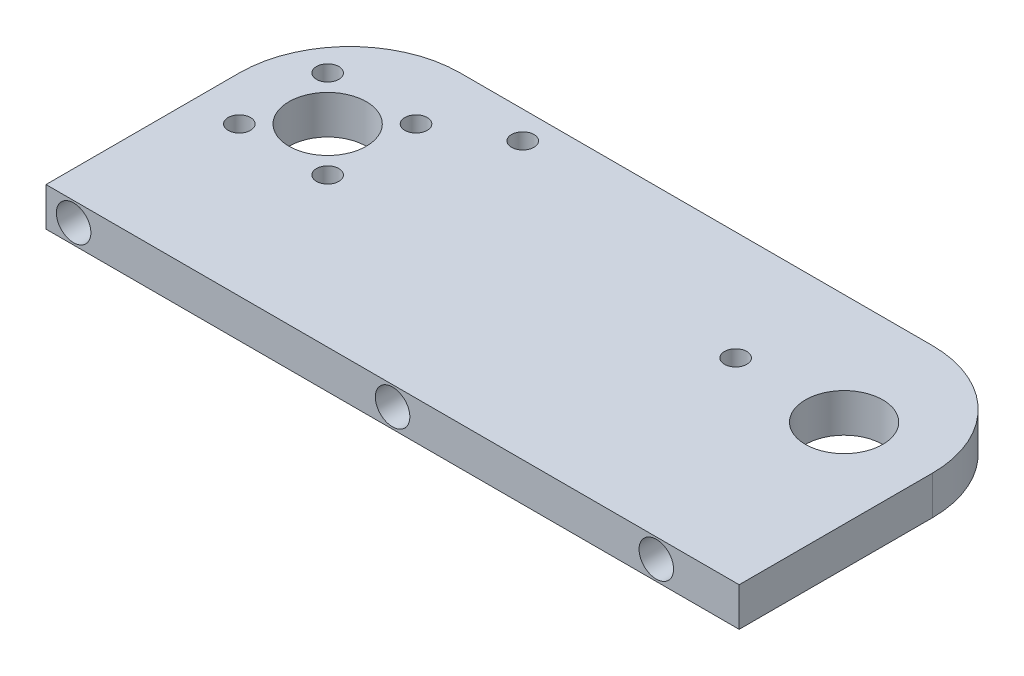
ISO-10303-21;
HEADER;
FILE_DESCRIPTION(('STEP AP214'),'2;1');
FILE_NAME('part.step','',(''),(''),'','','');
FILE_SCHEMA(('AUTOMOTIVE_DESIGN { 1 0 10303 214 1 1 1 1 }'));
ENDSEC;
DATA;
#1=APPLICATION_CONTEXT('core data for automotive mechanical design processes');
#2=APPLICATION_PROTOCOL_DEFINITION('international standard','automotive_design',2000,#1);
#3=PRODUCT_CONTEXT('',#1,'mechanical');
#4=PRODUCT('Part','Part','',(#3));
#5=PRODUCT_RELATED_PRODUCT_CATEGORY('part','',(#4));
#6=PRODUCT_DEFINITION_FORMATION('','',#4);
#7=PRODUCT_DEFINITION_CONTEXT('part definition',#1,'design');
#8=PRODUCT_DEFINITION('design','',#6,#7);
#9=PRODUCT_DEFINITION_SHAPE('','',#8);
#10=(LENGTH_UNIT() NAMED_UNIT(*) SI_UNIT(.MILLI.,.METRE.));
#11=(NAMED_UNIT(*) PLANE_ANGLE_UNIT() SI_UNIT($,.RADIAN.));
#12=(NAMED_UNIT(*) SI_UNIT($,.STERADIAN.) SOLID_ANGLE_UNIT());
#13=UNCERTAINTY_MEASURE_WITH_UNIT(LENGTH_MEASURE(1.E-05),#10,'distance_accuracy_value','');
#14=(GEOMETRIC_REPRESENTATION_CONTEXT(3) GLOBAL_UNCERTAINTY_ASSIGNED_CONTEXT((#13)) GLOBAL_UNIT_ASSIGNED_CONTEXT((#10,
#11,#12)) REPRESENTATION_CONTEXT('',''));
#15=CARTESIAN_POINT('',(0.,0.,0.));
#16=DIRECTION('',(0.,0.,1.));
#17=DIRECTION('',(1.,0.,0.));
#18=AXIS2_PLACEMENT_3D('',#15,#16,#17);
#19=CARTESIAN_POINT('',(145.701194149682,7.,0.));
#20=DIRECTION('',(1.,0.,0.));
#21=DIRECTION('',(0.,0.,-1.));
#22=AXIS2_PLACEMENT_3D('',#19,#20,#21);
#23=PLANE('',#22);
#24=DIRECTION('',(0.,0.,1.));
#25=VECTOR('',#24,1.);
#26=CARTESIAN_POINT('',(145.701194149682,0.,0.));
#27=LINE('',#26,#25);
#28=CARTESIAN_POINT('',(145.701194149682,0.,-31.8964427000415));
#29=VERTEX_POINT('',#28);
#30=CARTESIAN_POINT('',(145.701194149682,0.,3.10355729995856));
#31=VERTEX_POINT('',#30);
#32=EDGE_CURVE('E177',#29,#31,#27,.T.);
#33=ORIENTED_EDGE('',*,*,#32,.F.);
#34=DIRECTION('',(0.,-1.,0.));
#35=VECTOR('',#34,1.);
#36=CARTESIAN_POINT('',(145.701194149682,7.,-31.8964427000415));
#37=LINE('',#36,#35);
#38=CARTESIAN_POINT('',(145.701194149682,7.,-31.8964427000415));
#39=VERTEX_POINT('',#38);
#40=EDGE_CURVE('E68',#29,#39,#37,.F.);
#41=ORIENTED_EDGE('',*,*,#40,.T.);
#42=DIRECTION('',(0.,0.,1.));
#43=VECTOR('',#42,1.);
#44=CARTESIAN_POINT('',(145.701194149682,7.,0.));
#45=LINE('',#44,#43);
#46=CARTESIAN_POINT('',(145.701194149682,7.,3.10355729995856));
#47=VERTEX_POINT('',#46);
#48=EDGE_CURVE('E168',#39,#47,#45,.T.);
#49=ORIENTED_EDGE('',*,*,#48,.T.);
#50=DIRECTION('',(0.,-1.,0.));
#51=VECTOR('',#50,1.);
#52=CARTESIAN_POINT('',(145.701194149682,7.,3.10355729995856));
#53=LINE('',#52,#51);
#54=EDGE_CURVE('E114',#47,#31,#53,.T.);
#55=ORIENTED_EDGE('',*,*,#54,.T.);
#56=EDGE_LOOP('',(#33,#41,#49,#55));
#57=FACE_BOUND('',#56,.T.);
#58=ADVANCED_FACE('F43',(#57),#23,.T.);
#59=CARTESIAN_POINT('',(0.,7.,-51.8964427000415));
#60=DIRECTION('',(0.,0.,-1.));
#61=DIRECTION('',(-1.,0.,0.));
#62=AXIS2_PLACEMENT_3D('',#59,#60,#61);
#63=PLANE('',#62);
#64=DIRECTION('',(1.,0.,0.));
#65=VECTOR('',#64,1.);
#66=CARTESIAN_POINT('',(0.,7.,-51.8964427000415));
#67=LINE('',#66,#65);
#68=CARTESIAN_POINT('',(40.1890615993969,7.,-51.8964427000415));
#69=VERTEX_POINT('',#68);
#70=CARTESIAN_POINT('',(125.701194149682,7.,-51.8964427000415));
#71=VERTEX_POINT('',#70);
#72=EDGE_CURVE('E106',#69,#71,#67,.T.);
#73=ORIENTED_EDGE('',*,*,#72,.T.);
#74=DIRECTION('',(0.,-1.,0.));
#75=VECTOR('',#74,1.);
#76=CARTESIAN_POINT('',(125.701194149682,7.,-51.8964427000415));
#77=LINE('',#76,#75);
#78=CARTESIAN_POINT('',(125.701194149682,0.,-51.8964427000415));
#79=VERTEX_POINT('',#78);
#80=EDGE_CURVE('E122',#71,#79,#77,.T.);
#81=ORIENTED_EDGE('',*,*,#80,.T.);
#82=DIRECTION('',(1.,0.,0.));
#83=VECTOR('',#82,1.);
#84=CARTESIAN_POINT('',(0.,0.,-51.8964427000415));
#85=LINE('',#84,#83);
#86=CARTESIAN_POINT('',(40.1890615993969,0.,-51.8964427000415));
#87=VERTEX_POINT('',#86);
#88=EDGE_CURVE('E179',#87,#79,#85,.T.);
#89=ORIENTED_EDGE('',*,*,#88,.F.);
#90=DIRECTION('',(0.,-1.,0.));
#91=VECTOR('',#90,1.);
#92=CARTESIAN_POINT('',(40.1890615993969,7.,-51.8964427000415));
#93=LINE('',#92,#91);
#94=EDGE_CURVE('E120',#87,#69,#93,.F.);
#95=ORIENTED_EDGE('',*,*,#94,.T.);
#96=EDGE_LOOP('',(#73,#81,#89,#95));
#97=FACE_BOUND('',#96,.T.);
#98=ADVANCED_FACE('F190',(#97),#63,.T.);
#99=CARTESIAN_POINT('',(20.1890615993969,7.,0.));
#100=DIRECTION('',(1.,0.,0.));
#101=DIRECTION('',(0.,0.,-1.));
#102=AXIS2_PLACEMENT_3D('',#99,#100,#101);
#103=PLANE('',#102);
#104=DIRECTION('',(0.,0.,1.));
#105=VECTOR('',#104,1.);
#106=CARTESIAN_POINT('',(20.1890615993969,7.,0.));
#107=LINE('',#106,#105);
#108=CARTESIAN_POINT('',(20.1890615993969,7.,-31.8964427000415));
#109=VERTEX_POINT('',#108);
#110=CARTESIAN_POINT('',(20.1890615993969,7.,3.10355729995856));
#111=VERTEX_POINT('',#110);
#112=EDGE_CURVE('E98',#109,#111,#107,.T.);
#113=ORIENTED_EDGE('',*,*,#112,.F.);
#114=DIRECTION('',(0.,-1.,0.));
#115=VECTOR('',#114,1.);
#116=CARTESIAN_POINT('',(20.1890615993969,0.,-31.8964427000415));
#117=LINE('',#116,#115);
#118=CARTESIAN_POINT('',(20.1890615993969,0.,-31.8964427000415));
#119=VERTEX_POINT('',#118);
#120=EDGE_CURVE('E11',#109,#119,#117,.T.);
#121=ORIENTED_EDGE('',*,*,#120,.T.);
#122=DIRECTION('',(0.,0.,1.));
#123=VECTOR('',#122,1.);
#124=CARTESIAN_POINT('',(20.1890615993969,0.,0.));
#125=LINE('',#124,#123);
#126=CARTESIAN_POINT('',(20.1890615993969,0.,3.10355729995856));
#127=VERTEX_POINT('',#126);
#128=EDGE_CURVE('E118',#119,#127,#125,.T.);
#129=ORIENTED_EDGE('',*,*,#128,.T.);
#130=DIRECTION('',(0.,-1.,0.));
#131=VECTOR('',#130,1.);
#132=CARTESIAN_POINT('',(20.1890615993969,7.,3.10355729995856));
#133=LINE('',#132,#131);
#134=EDGE_CURVE('E112',#111,#127,#133,.T.);
#135=ORIENTED_EDGE('',*,*,#134,.F.);
#136=EDGE_LOOP('',(#113,#121,#129,#135));
#137=FACE_BOUND('',#136,.T.);
#138=ADVANCED_FACE('F116',(#137),#103,.F.);
#139=CARTESIAN_POINT('',(36.1890615993969,7.,-31.8964427000415));
#140=DIRECTION('',(0.,-1.,0.));
#141=DIRECTION('',(0.,0.,-1.));
#142=AXIS2_PLACEMENT_3D('',#139,#140,#141);
#143=CYLINDRICAL_SURFACE('',#142,7.);
#144=CARTESIAN_POINT('',(36.1890615993969,7.,-31.8964427000415));
#145=DIRECTION('',(0.,1.,0.));
#146=DIRECTION('',(0.,0.,1.));
#147=AXIS2_PLACEMENT_3D('',#144,#145,#146);
#148=CIRCLE('',#147,7.);
#149=CARTESIAN_POINT('',(36.1890615993969,7.,-24.8964427000415));
#150=VERTEX_POINT('',#149);
#151=EDGE_CURVE('E164',#150,#150,#148,.T.);
#152=ORIENTED_EDGE('',*,*,#151,.T.);
#153=EDGE_LOOP('',(#152));
#154=FACE_BOUND('',#153,.T.);
#155=CARTESIAN_POINT('',(36.1890615993969,0.,-31.8964427000415));
#156=DIRECTION('',(0.,1.,0.));
#157=DIRECTION('',(0.,0.,1.));
#158=AXIS2_PLACEMENT_3D('',#155,#156,#157);
#159=CIRCLE('',#158,7.);
#160=CARTESIAN_POINT('',(36.1890615993969,0.,-24.8964427000415));
#161=VERTEX_POINT('',#160);
#162=EDGE_CURVE('E174',#161,#161,#159,.T.);
#163=ORIENTED_EDGE('',*,*,#162,.F.);
#164=EDGE_LOOP('',(#163));
#165=FACE_BOUND('',#164,.T.);
#166=ADVANCED_FACE('F209',(#154,#165),#143,.F.);
#167=CARTESIAN_POINT('',(129.701194149682,7.,-31.8964427000415));
#168=DIRECTION('',(0.,-1.,0.));
#169=DIRECTION('',(0.,0.,-1.));
#170=AXIS2_PLACEMENT_3D('',#167,#168,#169);
#171=CYLINDRICAL_SURFACE('',#170,7.00000000000001);
#172=CARTESIAN_POINT('',(129.701194149682,7.,-31.8964427000415));
#173=DIRECTION('',(0.,1.,0.));
#174=DIRECTION('',(0.,0.,1.));
#175=AXIS2_PLACEMENT_3D('',#172,#173,#174);
#176=CIRCLE('',#175,7.00000000000001);
#177=CARTESIAN_POINT('',(129.701194149682,7.,-24.8964427000414));
#178=VERTEX_POINT('',#177);
#179=EDGE_CURVE('E161',#178,#178,#176,.T.);
#180=ORIENTED_EDGE('',*,*,#179,.T.);
#181=EDGE_LOOP('',(#180));
#182=FACE_BOUND('',#181,.T.);
#183=CARTESIAN_POINT('',(129.701194149682,0.,-31.8964427000415));
#184=DIRECTION('',(0.,1.,0.));
#185=DIRECTION('',(0.,0.,1.));
#186=AXIS2_PLACEMENT_3D('',#183,#184,#185);
#187=CIRCLE('',#186,7.00000000000001);
#188=CARTESIAN_POINT('',(129.701194149682,0.,-24.8964427000414));
#189=VERTEX_POINT('',#188);
#190=EDGE_CURVE('E139',#189,#189,#187,.T.);
#191=ORIENTED_EDGE('',*,*,#190,.F.);
#192=EDGE_LOOP('',(#191));
#193=FACE_BOUND('',#192,.T.);
#194=ADVANCED_FACE('F212',(#182,#193),#171,.F.);
#195=CARTESIAN_POINT('',(0.,7.,3.10355729995856));
#196=DIRECTION('',(0.,0.,-1.));
#197=DIRECTION('',(-1.,0.,0.));
#198=AXIS2_PLACEMENT_3D('',#195,#196,#197);
#199=PLANE('',#198);
#200=CARTESIAN_POINT('',(25.1890615993969,3.5,3.10355729995856));
#201=DIRECTION('',(0.,0.,1.));
#202=DIRECTION('',(1.,0.,0.));
#203=AXIS2_PLACEMENT_3D('',#200,#201,#202);
#204=CIRCLE('',#203,3.125);
#205=CARTESIAN_POINT('',(28.3140615993969,3.5,3.10355729995856));
#206=VERTEX_POINT('',#205);
#207=EDGE_CURVE('E437',#206,#206,#204,.T.);
#208=ORIENTED_EDGE('',*,*,#207,.F.);
#209=EDGE_LOOP('',(#208));
#210=FACE_BOUND('',#209,.T.);
#211=CARTESIAN_POINT('',(130.701194149682,3.5,3.10355729995856));
#212=DIRECTION('',(0.,0.,1.));
#213=DIRECTION('',(1.,0.,0.));
#214=AXIS2_PLACEMENT_3D('',#211,#212,#213);
#215=CIRCLE('',#214,3.125);
#216=CARTESIAN_POINT('',(133.826194149682,3.5,3.10355729995856));
#217=VERTEX_POINT('',#216);
#218=EDGE_CURVE('E443',#217,#217,#215,.T.);
#219=ORIENTED_EDGE('',*,*,#218,.F.);
#220=EDGE_LOOP('',(#219));
#221=FACE_BOUND('',#220,.T.);
#222=CARTESIAN_POINT('',(82.9451278745395,3.5,3.10355729995856));
#223=DIRECTION('',(0.,0.,1.));
#224=DIRECTION('',(1.,0.,0.));
#225=AXIS2_PLACEMENT_3D('',#222,#223,#224);
#226=CIRCLE('',#225,3.125);
#227=CARTESIAN_POINT('',(86.0701278745395,3.5,3.10355729995856));
#228=VERTEX_POINT('',#227);
#229=EDGE_CURVE('E430',#228,#228,#226,.T.);
#230=ORIENTED_EDGE('',*,*,#229,.F.);
#231=EDGE_LOOP('',(#230));
#232=FACE_BOUND('',#231,.T.);
#233=DIRECTION('',(1.,0.,0.));
#234=VECTOR('',#233,1.);
#235=CARTESIAN_POINT('',(0.,0.,3.10355729995856));
#236=LINE('',#235,#234);
#237=EDGE_CURVE('E165',#127,#31,#236,.T.);
#238=ORIENTED_EDGE('',*,*,#237,.T.);
#239=ORIENTED_EDGE('',*,*,#54,.F.);
#240=DIRECTION('',(1.,0.,0.));
#241=VECTOR('',#240,1.);
#242=CARTESIAN_POINT('',(0.,7.,3.10355729995856));
#243=LINE('',#242,#241);
#244=EDGE_CURVE('E101',#111,#47,#243,.T.);
#245=ORIENTED_EDGE('',*,*,#244,.F.);
#246=ORIENTED_EDGE('',*,*,#134,.T.);
#247=EDGE_LOOP('',(#238,#239,#245,#246));
#248=FACE_BOUND('',#247,.T.);
#249=ADVANCED_FACE('F111',(#210,#221,#232,#248),#199,.F.);
#250=CARTESIAN_POINT('',(0.,7.,0.));
#251=DIRECTION('',(0.,1.,0.));
#252=DIRECTION('',(0.,0.,1.));
#253=AXIS2_PLACEMENT_3D('',#250,#251,#252);
#254=PLANE('',#253);
#255=CARTESIAN_POINT('',(56.5146564494441,7.,-46.8964427000415));
#256=DIRECTION('',(0.,1.,0.));
#257=DIRECTION('',(0.,0.,1.));
#258=AXIS2_PLACEMENT_3D('',#255,#256,#257);
#259=CIRCLE('',#258,2.025);
#260=CARTESIAN_POINT('',(56.5146564494441,7.,-44.8714427000415));
#261=VERTEX_POINT('',#260);
#262=EDGE_CURVE('E428',#261,#261,#259,.T.);
#263=ORIENTED_EDGE('',*,*,#262,.F.);
#264=EDGE_LOOP('',(#263));
#265=FACE_BOUND('',#264,.T.);
#266=CARTESIAN_POINT('',(44.1890615993971,7.,-23.8964427000416));
#267=DIRECTION('',(0.,1.,0.));
#268=DIRECTION('',(0.,0.,1.));
#269=AXIS2_PLACEMENT_3D('',#266,#267,#268);
#270=CIRCLE('',#269,2.025);
#271=CARTESIAN_POINT('',(44.1890615993971,7.,-21.8714427000416));
#272=VERTEX_POINT('',#271);
#273=EDGE_CURVE('E436',#272,#272,#270,.T.);
#274=ORIENTED_EDGE('',*,*,#273,.F.);
#275=EDGE_LOOP('',(#274));
#276=FACE_BOUND('',#275,.T.);
#277=CARTESIAN_POINT('',(28.189061599397,7.,-23.8964427000415));
#278=DIRECTION('',(0.,1.,0.));
#279=DIRECTION('',(0.,0.,1.));
#280=AXIS2_PLACEMENT_3D('',#277,#278,#279);
#281=CIRCLE('',#280,2.025);
#282=CARTESIAN_POINT('',(28.189061599397,7.,-21.8714427000415));
#283=VERTEX_POINT('',#282);
#284=EDGE_CURVE('E454',#283,#283,#281,.T.);
#285=ORIENTED_EDGE('',*,*,#284,.F.);
#286=EDGE_LOOP('',(#285));
#287=FACE_BOUND('',#286,.T.);
#288=CARTESIAN_POINT('',(28.1890615993969,7.,-39.8964427000415));
#289=DIRECTION('',(0.,1.,0.));
#290=DIRECTION('',(0.,0.,1.));
#291=AXIS2_PLACEMENT_3D('',#288,#289,#290);
#292=CIRCLE('',#291,2.025);
#293=CARTESIAN_POINT('',(28.1890615993969,7.,-37.8714427000415));
#294=VERTEX_POINT('',#293);
#295=EDGE_CURVE('E451',#294,#294,#292,.T.);
#296=ORIENTED_EDGE('',*,*,#295,.F.);
#297=EDGE_LOOP('',(#296));
#298=FACE_BOUND('',#297,.T.);
#299=CARTESIAN_POINT('',(44.1890615993969,7.,-39.8964427000417));
#300=DIRECTION('',(0.,1.,0.));
#301=DIRECTION('',(0.,0.,1.));
#302=AXIS2_PLACEMENT_3D('',#299,#300,#301);
#303=CIRCLE('',#302,2.025);
#304=CARTESIAN_POINT('',(44.1890615993969,7.,-37.8714427000417));
#305=VERTEX_POINT('',#304);
#306=EDGE_CURVE('E145',#305,#305,#303,.T.);
#307=ORIENTED_EDGE('',*,*,#306,.F.);
#308=EDGE_LOOP('',(#307));
#309=FACE_BOUND('',#308,.T.);
#310=CARTESIAN_POINT('',(109.811194149682,7.,-32.1464427000415));
#311=DIRECTION('',(0.,1.,0.));
#312=DIRECTION('',(0.,0.,1.));
#313=AXIS2_PLACEMENT_3D('',#310,#311,#312);
#314=CIRCLE('',#313,2.02499999999999);
#315=CARTESIAN_POINT('',(109.811194149682,7.,-30.1214427000415));
#316=VERTEX_POINT('',#315);
#317=EDGE_CURVE('E140',#316,#316,#314,.T.);
#318=ORIENTED_EDGE('',*,*,#317,.F.);
#319=EDGE_LOOP('',(#318));
#320=FACE_BOUND('',#319,.T.);
#321=ORIENTED_EDGE('',*,*,#179,.F.);
#322=EDGE_LOOP('',(#321));
#323=FACE_BOUND('',#322,.T.);
#324=ORIENTED_EDGE('',*,*,#151,.F.);
#325=EDGE_LOOP('',(#324));
#326=FACE_BOUND('',#325,.T.);
#327=ORIENTED_EDGE('',*,*,#48,.F.);
#328=CARTESIAN_POINT('',(125.701194149682,7.,-31.8964427000415));
#329=DIRECTION('',(0.,1.,0.));
#330=DIRECTION('',(0.,0.,1.));
#331=AXIS2_PLACEMENT_3D('',#328,#329,#330);
#332=CIRCLE('',#331,20.);
#333=EDGE_CURVE('E52',#39,#71,#332,.T.);
#334=ORIENTED_EDGE('',*,*,#333,.T.);
#335=ORIENTED_EDGE('',*,*,#72,.F.);
#336=CARTESIAN_POINT('',(40.1890615993969,7.,-31.8964427000415));
#337=DIRECTION('',(0.,1.,0.));
#338=DIRECTION('',(0.,0.,1.));
#339=AXIS2_PLACEMENT_3D('',#336,#337,#338);
#340=CIRCLE('',#339,20.);
#341=EDGE_CURVE('E60',#69,#109,#340,.T.);
#342=ORIENTED_EDGE('',*,*,#341,.T.);
#343=ORIENTED_EDGE('',*,*,#112,.T.);
#344=ORIENTED_EDGE('',*,*,#244,.T.);
#345=EDGE_LOOP('',(#327,#334,#335,#342,#343,#344));
#346=FACE_BOUND('',#345,.T.);
#347=ADVANCED_FACE('F100',(#265,#276,#287,#298,#309,#320,#323,#326,#346),#254,.T.);
#348=CARTESIAN_POINT('',(0.,0.,0.));
#349=DIRECTION('',(0.,1.,0.));
#350=DIRECTION('',(0.,0.,1.));
#351=AXIS2_PLACEMENT_3D('',#348,#349,#350);
#352=PLANE('',#351);
#353=CARTESIAN_POINT('',(56.5146564494441,0.,-46.8964427000415));
#354=DIRECTION('',(0.,1.,0.));
#355=DIRECTION('',(0.,0.,1.));
#356=AXIS2_PLACEMENT_3D('',#353,#354,#355);
#357=CIRCLE('',#356,2.025);
#358=CARTESIAN_POINT('',(56.5146564494441,0.,-44.8714427000415));
#359=VERTEX_POINT('',#358);
#360=EDGE_CURVE('E425',#359,#359,#357,.T.);
#361=ORIENTED_EDGE('',*,*,#360,.T.);
#362=EDGE_LOOP('',(#361));
#363=FACE_BOUND('',#362,.T.);
#364=CARTESIAN_POINT('',(44.1890615993971,0.,-23.8964427000416));
#365=DIRECTION('',(0.,1.,0.));
#366=DIRECTION('',(0.,0.,1.));
#367=AXIS2_PLACEMENT_3D('',#364,#365,#366);
#368=CIRCLE('',#367,2.025);
#369=CARTESIAN_POINT('',(44.1890615993971,0.,-21.8714427000416));
#370=VERTEX_POINT('',#369);
#371=EDGE_CURVE('E47',#370,#370,#368,.T.);
#372=ORIENTED_EDGE('',*,*,#371,.T.);
#373=EDGE_LOOP('',(#372));
#374=FACE_BOUND('',#373,.T.);
#375=CARTESIAN_POINT('',(28.189061599397,0.,-23.8964427000415));
#376=DIRECTION('',(0.,1.,0.));
#377=DIRECTION('',(0.,0.,1.));
#378=AXIS2_PLACEMENT_3D('',#375,#376,#377);
#379=CIRCLE('',#378,2.025);
#380=CARTESIAN_POINT('',(28.189061599397,0.,-21.8714427000415));
#381=VERTEX_POINT('',#380);
#382=EDGE_CURVE('E147',#381,#381,#379,.T.);
#383=ORIENTED_EDGE('',*,*,#382,.T.);
#384=EDGE_LOOP('',(#383));
#385=FACE_BOUND('',#384,.T.);
#386=CARTESIAN_POINT('',(28.1890615993969,0.,-39.8964427000415));
#387=DIRECTION('',(0.,1.,0.));
#388=DIRECTION('',(0.,0.,1.));
#389=AXIS2_PLACEMENT_3D('',#386,#387,#388);
#390=CIRCLE('',#389,2.025);
#391=CARTESIAN_POINT('',(28.1890615993969,0.,-37.8714427000415));
#392=VERTEX_POINT('',#391);
#393=EDGE_CURVE('E144',#392,#392,#390,.T.);
#394=ORIENTED_EDGE('',*,*,#393,.T.);
#395=EDGE_LOOP('',(#394));
#396=FACE_BOUND('',#395,.T.);
#397=CARTESIAN_POINT('',(44.1890615993969,0.,-39.8964427000417));
#398=DIRECTION('',(0.,1.,0.));
#399=DIRECTION('',(0.,0.,1.));
#400=AXIS2_PLACEMENT_3D('',#397,#398,#399);
#401=CIRCLE('',#400,2.025);
#402=CARTESIAN_POINT('',(44.1890615993969,0.,-37.8714427000417));
#403=VERTEX_POINT('',#402);
#404=EDGE_CURVE('E141',#403,#403,#401,.T.);
#405=ORIENTED_EDGE('',*,*,#404,.T.);
#406=EDGE_LOOP('',(#405));
#407=FACE_BOUND('',#406,.T.);
#408=CARTESIAN_POINT('',(109.811194149682,0.,-32.1464427000415));
#409=DIRECTION('',(0.,1.,0.));
#410=DIRECTION('',(0.,0.,1.));
#411=AXIS2_PLACEMENT_3D('',#408,#409,#410);
#412=CIRCLE('',#411,2.02499999999999);
#413=CARTESIAN_POINT('',(109.811194149682,0.,-30.1214427000415));
#414=VERTEX_POINT('',#413);
#415=EDGE_CURVE('E136',#414,#414,#412,.T.);
#416=ORIENTED_EDGE('',*,*,#415,.T.);
#417=EDGE_LOOP('',(#416));
#418=FACE_BOUND('',#417,.T.);
#419=ORIENTED_EDGE('',*,*,#190,.T.);
#420=EDGE_LOOP('',(#419));
#421=FACE_BOUND('',#420,.T.);
#422=ORIENTED_EDGE('',*,*,#162,.T.);
#423=EDGE_LOOP('',(#422));
#424=FACE_BOUND('',#423,.T.);
#425=ORIENTED_EDGE('',*,*,#88,.T.);
#426=CARTESIAN_POINT('',(125.701194149682,0.,-31.8964427000415));
#427=DIRECTION('',(0.,1.,0.));
#428=DIRECTION('',(0.,0.,1.));
#429=AXIS2_PLACEMENT_3D('',#426,#427,#428);
#430=CIRCLE('',#429,20.);
#431=EDGE_CURVE('E131',#79,#29,#430,.F.);
#432=ORIENTED_EDGE('',*,*,#431,.T.);
#433=ORIENTED_EDGE('',*,*,#32,.T.);
#434=ORIENTED_EDGE('',*,*,#237,.F.);
#435=ORIENTED_EDGE('',*,*,#128,.F.);
#436=CARTESIAN_POINT('',(40.1890615993969,0.,-31.8964427000415));
#437=DIRECTION('',(0.,1.,0.));
#438=DIRECTION('',(0.,0.,1.));
#439=AXIS2_PLACEMENT_3D('',#436,#437,#438);
#440=CIRCLE('',#439,20.);
#441=EDGE_CURVE('E129',#119,#87,#440,.F.);
#442=ORIENTED_EDGE('',*,*,#441,.T.);
#443=EDGE_LOOP('',(#425,#432,#433,#434,#435,#442));
#444=FACE_BOUND('',#443,.T.);
#445=ADVANCED_FACE('F183',(#363,#374,#385,#396,#407,#418,#421,#424,#444),#352,.F.);
#446=CARTESIAN_POINT('',(125.701194149682,7.,-31.8964427000415));
#447=DIRECTION('',(0.,-1.,0.));
#448=DIRECTION('',(0.,0.,-1.));
#449=AXIS2_PLACEMENT_3D('',#446,#447,#448);
#450=CYLINDRICAL_SURFACE('',#449,20.);
#451=ORIENTED_EDGE('',*,*,#333,.F.);
#452=ORIENTED_EDGE('',*,*,#40,.F.);
#453=ORIENTED_EDGE('',*,*,#431,.F.);
#454=ORIENTED_EDGE('',*,*,#80,.F.);
#455=EDGE_LOOP('',(#451,#452,#453,#454));
#456=FACE_BOUND('',#455,.T.);
#457=ADVANCED_FACE('F187',(#456),#450,.T.);
#458=CARTESIAN_POINT('',(40.1890615993969,7.,-31.8964427000415));
#459=DIRECTION('',(0.,1.,0.));
#460=DIRECTION('',(0.,0.,1.));
#461=AXIS2_PLACEMENT_3D('',#458,#459,#460);
#462=CYLINDRICAL_SURFACE('',#461,20.);
#463=ORIENTED_EDGE('',*,*,#341,.F.);
#464=ORIENTED_EDGE('',*,*,#94,.F.);
#465=ORIENTED_EDGE('',*,*,#441,.F.);
#466=ORIENTED_EDGE('',*,*,#120,.F.);
#467=EDGE_LOOP('',(#463,#464,#465,#466));
#468=FACE_BOUND('',#467,.T.);
#469=ADVANCED_FACE('F45',(#468),#462,.T.);
#470=CARTESIAN_POINT('',(109.811194149682,-3.,-32.1464427000415));
#471=DIRECTION('',(0.,1.,0.));
#472=DIRECTION('',(0.,0.,1.));
#473=AXIS2_PLACEMENT_3D('',#470,#471,#472);
#474=CYLINDRICAL_SURFACE('',#473,2.02499999999999);
#475=ORIENTED_EDGE('',*,*,#317,.T.);
#476=EDGE_LOOP('',(#475));
#477=FACE_BOUND('',#476,.T.);
#478=ORIENTED_EDGE('',*,*,#415,.F.);
#479=EDGE_LOOP('',(#478));
#480=FACE_BOUND('',#479,.T.);
#481=ADVANCED_FACE('F194',(#477,#480),#474,.F.);
#482=CARTESIAN_POINT('',(44.1890615993969,-26.,-39.8964427000417));
#483=DIRECTION('',(0.,1.,0.));
#484=DIRECTION('',(0.,0.,1.));
#485=AXIS2_PLACEMENT_3D('',#482,#483,#484);
#486=CYLINDRICAL_SURFACE('',#485,2.025);
#487=ORIENTED_EDGE('',*,*,#306,.T.);
#488=EDGE_LOOP('',(#487));
#489=FACE_BOUND('',#488,.T.);
#490=ORIENTED_EDGE('',*,*,#404,.F.);
#491=EDGE_LOOP('',(#490));
#492=FACE_BOUND('',#491,.T.);
#493=ADVANCED_FACE('F199',(#489,#492),#486,.F.);
#494=CARTESIAN_POINT('',(28.1890615993969,-26.,-39.8964427000415));
#495=DIRECTION('',(0.,1.,0.));
#496=DIRECTION('',(0.,0.,1.));
#497=AXIS2_PLACEMENT_3D('',#494,#495,#496);
#498=CYLINDRICAL_SURFACE('',#497,2.025);
#499=ORIENTED_EDGE('',*,*,#295,.T.);
#500=EDGE_LOOP('',(#499));
#501=FACE_BOUND('',#500,.T.);
#502=ORIENTED_EDGE('',*,*,#393,.F.);
#503=EDGE_LOOP('',(#502));
#504=FACE_BOUND('',#503,.T.);
#505=ADVANCED_FACE('F323',(#501,#504),#498,.F.);
#506=CARTESIAN_POINT('',(28.189061599397,-26.,-23.8964427000415));
#507=DIRECTION('',(0.,1.,0.));
#508=DIRECTION('',(0.,0.,1.));
#509=AXIS2_PLACEMENT_3D('',#506,#507,#508);
#510=CYLINDRICAL_SURFACE('',#509,2.025);
#511=ORIENTED_EDGE('',*,*,#284,.T.);
#512=EDGE_LOOP('',(#511));
#513=FACE_BOUND('',#512,.T.);
#514=ORIENTED_EDGE('',*,*,#382,.F.);
#515=EDGE_LOOP('',(#514));
#516=FACE_BOUND('',#515,.T.);
#517=ADVANCED_FACE('F332',(#513,#516),#510,.F.);
#518=CARTESIAN_POINT('',(44.1890615993971,-26.,-23.8964427000416));
#519=DIRECTION('',(0.,1.,0.));
#520=DIRECTION('',(0.,0.,1.));
#521=AXIS2_PLACEMENT_3D('',#518,#519,#520);
#522=CYLINDRICAL_SURFACE('',#521,2.025);
#523=ORIENTED_EDGE('',*,*,#273,.T.);
#524=EDGE_LOOP('',(#523));
#525=FACE_BOUND('',#524,.T.);
#526=ORIENTED_EDGE('',*,*,#371,.F.);
#527=EDGE_LOOP('',(#526));
#528=FACE_BOUND('',#527,.T.);
#529=ADVANCED_FACE('F341',(#525,#528),#522,.F.);
#530=CARTESIAN_POINT('',(82.9451278745395,3.5,-1.59644270004144));
#531=DIRECTION('',(0.,0.,1.));
#532=DIRECTION('',(1.,0.,0.));
#533=AXIS2_PLACEMENT_3D('',#530,#531,#532);
#534=CYLINDRICAL_SURFACE('',#533,3.125);
#535=CARTESIAN_POINT('',(82.9451278745395,3.5,-1.59644270004144));
#536=DIRECTION('',(0.,0.,1.));
#537=DIRECTION('',(1.,0.,0.));
#538=AXIS2_PLACEMENT_3D('',#535,#536,#537);
#539=CIRCLE('',#538,3.125);
#540=CARTESIAN_POINT('',(86.0701278745395,3.5,-1.59644270004144));
#541=VERTEX_POINT('',#540);
#542=EDGE_CURVE('E446',#541,#541,#539,.T.);
#543=ORIENTED_EDGE('',*,*,#542,.F.);
#544=EDGE_LOOP('',(#543));
#545=FACE_BOUND('',#544,.T.);
#546=ORIENTED_EDGE('',*,*,#229,.T.);
#547=EDGE_LOOP('',(#546));
#548=FACE_BOUND('',#547,.T.);
#549=ADVANCED_FACE('F349',(#545,#548),#534,.F.);
#550=CARTESIAN_POINT('',(82.9451278745395,3.5,-1.59644270004144));
#551=DIRECTION('',(0.,0.,1.));
#552=DIRECTION('',(1.,0.,0.));
#553=AXIS2_PLACEMENT_3D('',#550,#551,#552);
#554=PLANE('',#553);
#555=ORIENTED_EDGE('',*,*,#542,.T.);
#556=EDGE_LOOP('',(#555));
#557=FACE_BOUND('',#556,.T.);
#558=ADVANCED_FACE('F357',(#557),#554,.T.);
#559=CARTESIAN_POINT('',(130.701194149682,3.5,-1.59644270004144));
#560=DIRECTION('',(0.,0.,1.));
#561=DIRECTION('',(1.,0.,0.));
#562=AXIS2_PLACEMENT_3D('',#559,#560,#561);
#563=CYLINDRICAL_SURFACE('',#562,3.125);
#564=CARTESIAN_POINT('',(130.701194149682,3.5,-1.59644270004144));
#565=DIRECTION('',(0.,0.,1.));
#566=DIRECTION('',(1.,0.,0.));
#567=AXIS2_PLACEMENT_3D('',#564,#565,#566);
#568=CIRCLE('',#567,3.125);
#569=CARTESIAN_POINT('',(133.826194149682,3.5,-1.59644270004144));
#570=VERTEX_POINT('',#569);
#571=EDGE_CURVE('E440',#570,#570,#568,.T.);
#572=ORIENTED_EDGE('',*,*,#571,.F.);
#573=EDGE_LOOP('',(#572));
#574=FACE_BOUND('',#573,.T.);
#575=ORIENTED_EDGE('',*,*,#218,.T.);
#576=EDGE_LOOP('',(#575));
#577=FACE_BOUND('',#576,.T.);
#578=ADVANCED_FACE('F366',(#574,#577),#563,.F.);
#579=CARTESIAN_POINT('',(130.701194149682,3.5,-1.59644270004144));
#580=DIRECTION('',(0.,0.,1.));
#581=DIRECTION('',(1.,0.,0.));
#582=AXIS2_PLACEMENT_3D('',#579,#580,#581);
#583=PLANE('',#582);
#584=ORIENTED_EDGE('',*,*,#571,.T.);
#585=EDGE_LOOP('',(#584));
#586=FACE_BOUND('',#585,.T.);
#587=ADVANCED_FACE('F375',(#586),#583,.T.);
#588=CARTESIAN_POINT('',(25.1890615993969,3.5,-1.59644270004144));
#589=DIRECTION('',(0.,0.,1.));
#590=DIRECTION('',(1.,0.,0.));
#591=AXIS2_PLACEMENT_3D('',#588,#589,#590);
#592=CYLINDRICAL_SURFACE('',#591,3.125);
#593=CARTESIAN_POINT('',(25.1890615993969,3.5,-1.59644270004144));
#594=DIRECTION('',(0.,0.,1.));
#595=DIRECTION('',(1.,0.,0.));
#596=AXIS2_PLACEMENT_3D('',#593,#594,#595);
#597=CIRCLE('',#596,3.125);
#598=CARTESIAN_POINT('',(28.3140615993969,3.5,-1.59644270004144));
#599=VERTEX_POINT('',#598);
#600=EDGE_CURVE('E433',#599,#599,#597,.T.);
#601=ORIENTED_EDGE('',*,*,#600,.F.);
#602=EDGE_LOOP('',(#601));
#603=FACE_BOUND('',#602,.T.);
#604=ORIENTED_EDGE('',*,*,#207,.T.);
#605=EDGE_LOOP('',(#604));
#606=FACE_BOUND('',#605,.T.);
#607=ADVANCED_FACE('F384',(#603,#606),#592,.F.);
#608=CARTESIAN_POINT('',(25.1890615993969,3.5,-1.59644270004144));
#609=DIRECTION('',(0.,0.,1.));
#610=DIRECTION('',(1.,0.,0.));
#611=AXIS2_PLACEMENT_3D('',#608,#609,#610);
#612=PLANE('',#611);
#613=ORIENTED_EDGE('',*,*,#600,.T.);
#614=EDGE_LOOP('',(#613));
#615=FACE_BOUND('',#614,.T.);
#616=ADVANCED_FACE('F393',(#615),#612,.T.);
#617=CARTESIAN_POINT('',(56.5146564494441,0.,-46.8964427000415));
#618=DIRECTION('',(0.,1.,0.));
#619=DIRECTION('',(0.,0.,1.));
#620=AXIS2_PLACEMENT_3D('',#617,#618,#619);
#621=CYLINDRICAL_SURFACE('',#620,2.025);
#622=ORIENTED_EDGE('',*,*,#360,.F.);
#623=EDGE_LOOP('',(#622));
#624=FACE_BOUND('',#623,.T.);
#625=ORIENTED_EDGE('',*,*,#262,.T.);
#626=EDGE_LOOP('',(#625));
#627=FACE_BOUND('',#626,.T.);
#628=ADVANCED_FACE('F401',(#624,#627),#621,.F.);
#629=CLOSED_SHELL('',(#58,#98,#138,#166,#194,#249,#347,#445,#457,#469,#481,#493,#505,#517,#529,
#549,#558,#578,#587,#607,#616,#628));
#630=MANIFOLD_SOLID_BREP('B2',#629);
#631=ADVANCED_BREP_SHAPE_REPRESENTATION('',(#18,#630),#14);
#632=SHAPE_DEFINITION_REPRESENTATION(#9,#631);
ENDSEC;
END-ISO-10303-21;
